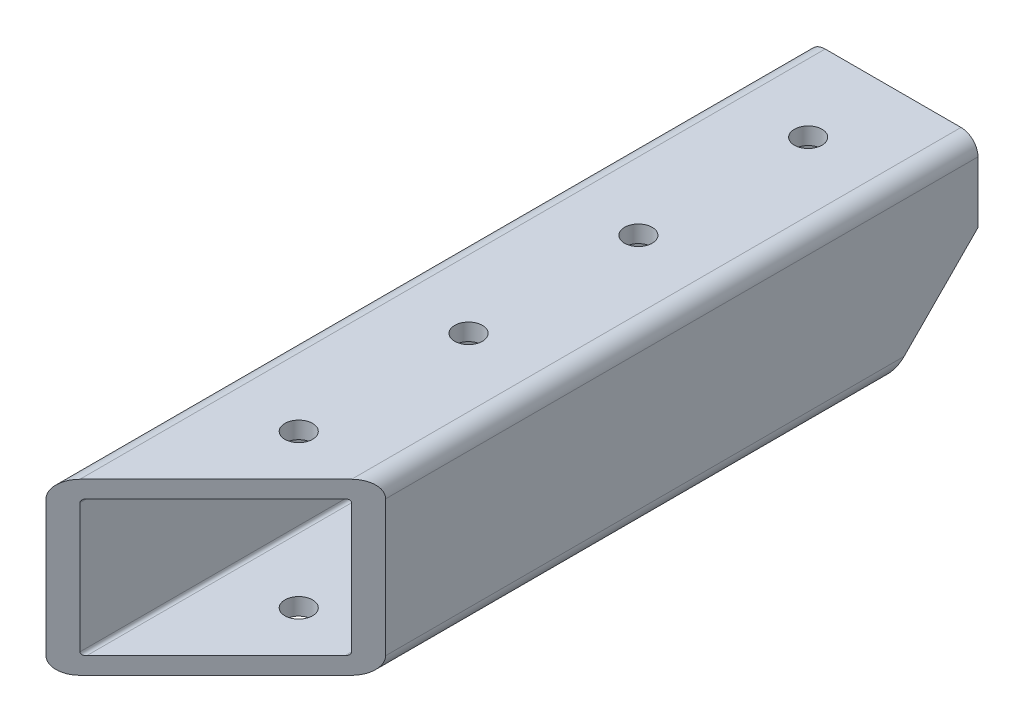
ISO-10303-21;
HEADER;
FILE_DESCRIPTION(('STEP AP214'),'2;1');
FILE_NAME('part.step','',(''),(''),'','','');
FILE_SCHEMA(('AUTOMOTIVE_DESIGN { 1 0 10303 214 1 1 1 1 }'));
ENDSEC;
DATA;
#1=APPLICATION_CONTEXT('core data for automotive mechanical design processes');
#2=APPLICATION_PROTOCOL_DEFINITION('international standard','automotive_design',2000,#1);
#3=PRODUCT_CONTEXT('',#1,'mechanical');
#4=PRODUCT('Part','Part','',(#3));
#5=PRODUCT_RELATED_PRODUCT_CATEGORY('part','',(#4));
#6=PRODUCT_DEFINITION_FORMATION('','',#4);
#7=PRODUCT_DEFINITION_CONTEXT('part definition',#1,'design');
#8=PRODUCT_DEFINITION('design','',#6,#7);
#9=PRODUCT_DEFINITION_SHAPE('','',#8);
#10=(LENGTH_UNIT() NAMED_UNIT(*) SI_UNIT(.MILLI.,.METRE.));
#11=(NAMED_UNIT(*) PLANE_ANGLE_UNIT() SI_UNIT($,.RADIAN.));
#12=(NAMED_UNIT(*) SI_UNIT($,.STERADIAN.) SOLID_ANGLE_UNIT());
#13=UNCERTAINTY_MEASURE_WITH_UNIT(LENGTH_MEASURE(1.E-05),#10,'distance_accuracy_value','');
#14=(GEOMETRIC_REPRESENTATION_CONTEXT(3) GLOBAL_UNCERTAINTY_ASSIGNED_CONTEXT((#13)) GLOBAL_UNIT_ASSIGNED_CONTEXT((#10,
#11,#12)) REPRESENTATION_CONTEXT('',''));
#15=CARTESIAN_POINT('',(0.,0.,0.));
#16=DIRECTION('',(0.,0.,1.));
#17=DIRECTION('',(1.,0.,0.));
#18=AXIS2_PLACEMENT_3D('',#15,#16,#17);
#19=CARTESIAN_POINT('',(0.,-12.7,-711.2));
#20=DIRECTION('',(0.,1.,0.));
#21=DIRECTION('',(0.,0.,1.));
#22=AXIS2_PLACEMENT_3D('',#19,#20,#21);
#23=CYLINDRICAL_SURFACE('',#22,2.07009999999996);
#24=CARTESIAN_POINT('',(0.,10.16,-711.2));
#25=DIRECTION('',(0.,1.,0.));
#26=DIRECTION('',(0.,0.,1.));
#27=AXIS2_PLACEMENT_3D('',#24,#25,#26);
#28=CIRCLE('',#27,2.07009999999996);
#29=CARTESIAN_POINT('',(0.,10.16,-709.1299));
#30=VERTEX_POINT('',#29);
#31=EDGE_CURVE('E269',#30,#30,#28,.T.);
#32=ORIENTED_EDGE('',*,*,#31,.F.);
#33=EDGE_LOOP('',(#32));
#34=FACE_BOUND('',#33,.T.);
#35=CARTESIAN_POINT('',(0.,12.7,-711.2));
#36=DIRECTION('',(0.,1.,0.));
#37=DIRECTION('',(0.,0.,1.));
#38=AXIS2_PLACEMENT_3D('',#35,#36,#37);
#39=CIRCLE('',#38,2.07009999999996);
#40=CARTESIAN_POINT('',(0.,12.7,-709.1299));
#41=VERTEX_POINT('',#40);
#42=EDGE_CURVE('E297',#41,#41,#39,.T.);
#43=ORIENTED_EDGE('',*,*,#42,.T.);
#44=EDGE_LOOP('',(#43));
#45=FACE_BOUND('',#44,.T.);
#46=ADVANCED_FACE('F35',(#34,#45),#23,.F.);
#47=CARTESIAN_POINT('',(0.,-12.7,-736.6));
#48=DIRECTION('',(0.,1.,0.));
#49=DIRECTION('',(0.,0.,1.));
#50=AXIS2_PLACEMENT_3D('',#47,#48,#49);
#51=CYLINDRICAL_SURFACE('',#50,2.07009999999996);
#52=CARTESIAN_POINT('',(0.,10.16,-736.6));
#53=DIRECTION('',(0.,1.,0.));
#54=DIRECTION('',(0.,0.,1.));
#55=AXIS2_PLACEMENT_3D('',#52,#53,#54);
#56=CIRCLE('',#55,2.07009999999996);
#57=CARTESIAN_POINT('',(0.,10.16,-734.5299));
#58=VERTEX_POINT('',#57);
#59=EDGE_CURVE('E266',#58,#58,#56,.T.);
#60=ORIENTED_EDGE('',*,*,#59,.F.);
#61=EDGE_LOOP('',(#60));
#62=FACE_BOUND('',#61,.T.);
#63=CARTESIAN_POINT('',(0.,12.7,-736.6));
#64=DIRECTION('',(0.,1.,0.));
#65=DIRECTION('',(0.,0.,1.));
#66=AXIS2_PLACEMENT_3D('',#63,#64,#65);
#67=CIRCLE('',#66,2.07009999999996);
#68=CARTESIAN_POINT('',(0.,12.7,-734.5299));
#69=VERTEX_POINT('',#68);
#70=EDGE_CURVE('E294',#69,#69,#67,.T.);
#71=ORIENTED_EDGE('',*,*,#70,.T.);
#72=EDGE_LOOP('',(#71));
#73=FACE_BOUND('',#72,.T.);
#74=ADVANCED_FACE('F659',(#62,#73),#51,.F.);
#75=CARTESIAN_POINT('',(-9.65999999999999,9.66,749.3));
#76=DIRECTION('',(0.,0.,1.));
#77=DIRECTION('',(1.,0.,0.));
#78=AXIS2_PLACEMENT_3D('',#75,#76,#77);
#79=CYLINDRICAL_SURFACE('',#78,0.5);
#80=DIRECTION('',(0.,0.,-1.));
#81=VECTOR('',#80,1.);
#82=CARTESIAN_POINT('',(-9.65999999999999,10.16,749.3));
#83=LINE('',#82,#81);
#84=CARTESIAN_POINT('',(-9.66000000000005,10.16,-638.337524484275));
#85=VERTEX_POINT('',#84);
#86=CARTESIAN_POINT('',(-9.65999999999999,10.16,-749.3));
#87=VERTEX_POINT('',#86);
#88=EDGE_CURVE('E260',#85,#87,#83,.T.);
#89=ORIENTED_EDGE('',*,*,#88,.F.);
#90=CARTESIAN_POINT('',(-9.65999999999999,9.66,-638.337524484276));
#91=DIRECTION('',(-0.707106781186566,0.,-0.707106781186529));
#92=DIRECTION('',(-0.707106781186529,0.,0.707106781186566));
#93=AXIS2_PLACEMENT_3D('',#90,#91,#92);
#94=ELLIPSE('',#93,0.707106781186567,0.5);
#95=CARTESIAN_POINT('',(-10.16,9.66,-637.837524484275));
#96=VERTEX_POINT('',#95);
#97=EDGE_CURVE('E353',#85,#96,#94,.F.);
#98=ORIENTED_EDGE('',*,*,#97,.T.);
#99=DIRECTION('',(0.,0.,-1.));
#100=VECTOR('',#99,1.);
#101=CARTESIAN_POINT('',(-10.16,9.66,749.3));
#102=LINE('',#101,#100);
#103=CARTESIAN_POINT('',(-10.16,9.66,-749.3));
#104=VERTEX_POINT('',#103);
#105=EDGE_CURVE('E206',#104,#96,#102,.F.);
#106=ORIENTED_EDGE('',*,*,#105,.F.);
#107=CARTESIAN_POINT('',(-9.65999999999999,9.66,-749.3));
#108=DIRECTION('',(0.,0.,1.));
#109=DIRECTION('',(1.,0.,0.));
#110=AXIS2_PLACEMENT_3D('',#107,#108,#109);
#111=CIRCLE('',#110,0.5);
#112=EDGE_CURVE('E303',#87,#104,#111,.T.);
#113=ORIENTED_EDGE('',*,*,#112,.F.);
#114=EDGE_LOOP('',(#89,#98,#106,#113));
#115=FACE_BOUND('',#114,.T.);
#116=ADVANCED_FACE('F653',(#115),#79,.F.);
#117=CARTESIAN_POINT('',(0.,-12.7,-685.8));
#118=DIRECTION('',(0.,1.,0.));
#119=DIRECTION('',(0.,0.,1.));
#120=AXIS2_PLACEMENT_3D('',#117,#118,#119);
#121=CYLINDRICAL_SURFACE('',#120,2.07009999999996);
#122=CARTESIAN_POINT('',(0.,10.16,-685.8));
#123=DIRECTION('',(0.,1.,0.));
#124=DIRECTION('',(0.,0.,1.));
#125=AXIS2_PLACEMENT_3D('',#122,#123,#124);
#126=CIRCLE('',#125,2.07009999999996);
#127=CARTESIAN_POINT('',(0.,10.16,-683.7299));
#128=VERTEX_POINT('',#127);
#129=EDGE_CURVE('E257',#128,#128,#126,.T.);
#130=ORIENTED_EDGE('',*,*,#129,.F.);
#131=EDGE_LOOP('',(#130));
#132=FACE_BOUND('',#131,.T.);
#133=CARTESIAN_POINT('',(0.,12.7,-685.8));
#134=DIRECTION('',(0.,1.,0.));
#135=DIRECTION('',(0.,0.,1.));
#136=AXIS2_PLACEMENT_3D('',#133,#134,#135);
#137=CIRCLE('',#136,2.07009999999996);
#138=CARTESIAN_POINT('',(0.,12.7,-683.7299));
#139=VERTEX_POINT('',#138);
#140=EDGE_CURVE('E291',#139,#139,#137,.T.);
#141=ORIENTED_EDGE('',*,*,#140,.T.);
#142=EDGE_LOOP('',(#141));
#143=FACE_BOUND('',#142,.T.);
#144=ADVANCED_FACE('F658',(#132,#143),#121,.F.);
#145=CARTESIAN_POINT('',(0.,-12.7,-660.4));
#146=DIRECTION('',(0.,1.,0.));
#147=DIRECTION('',(0.,0.,1.));
#148=AXIS2_PLACEMENT_3D('',#145,#146,#147);
#149=CYLINDRICAL_SURFACE('',#148,2.07009999999996);
#150=CARTESIAN_POINT('',(0.,10.16,-660.4));
#151=DIRECTION('',(0.,1.,0.));
#152=DIRECTION('',(0.,0.,1.));
#153=AXIS2_PLACEMENT_3D('',#150,#151,#152);
#154=CIRCLE('',#153,2.07009999999996);
#155=CARTESIAN_POINT('',(0.,10.16,-658.3299));
#156=VERTEX_POINT('',#155);
#157=EDGE_CURVE('E253',#156,#156,#154,.T.);
#158=ORIENTED_EDGE('',*,*,#157,.F.);
#159=EDGE_LOOP('',(#158));
#160=FACE_BOUND('',#159,.T.);
#161=CARTESIAN_POINT('',(0.,12.7,-660.4));
#162=DIRECTION('',(0.,1.,0.));
#163=DIRECTION('',(0.,0.,1.));
#164=AXIS2_PLACEMENT_3D('',#161,#162,#163);
#165=CIRCLE('',#164,2.07009999999996);
#166=CARTESIAN_POINT('',(0.,12.7,-658.3299));
#167=VERTEX_POINT('',#166);
#168=EDGE_CURVE('E288',#167,#167,#165,.T.);
#169=ORIENTED_EDGE('',*,*,#168,.T.);
#170=EDGE_LOOP('',(#169));
#171=FACE_BOUND('',#170,.T.);
#172=ADVANCED_FACE('F644',(#160,#171),#149,.F.);
#173=CARTESIAN_POINT('',(9.66,9.65999999999999,749.3));
#174=DIRECTION('',(0.,0.,1.));
#175=DIRECTION('',(1.,0.,0.));
#176=AXIS2_PLACEMENT_3D('',#173,#174,#175);
#177=CYLINDRICAL_SURFACE('',#176,0.5);
#178=DIRECTION('',(0.,0.,1.));
#179=VECTOR('',#178,1.);
#180=CARTESIAN_POINT('',(10.16,9.65999999999999,749.3));
#181=LINE('',#180,#179);
#182=CARTESIAN_POINT('',(10.16,9.65999999999999,-658.157524484277));
#183=VERTEX_POINT('',#182);
#184=CARTESIAN_POINT('',(10.16,9.65999999999999,-749.3));
#185=VERTEX_POINT('',#184);
#186=EDGE_CURVE('E256',#183,#185,#181,.F.);
#187=ORIENTED_EDGE('',*,*,#186,.F.);
#188=CARTESIAN_POINT('',(9.66,9.65999999999999,-657.657524484276));
#189=DIRECTION('',(-0.707106781186566,0.,-0.707106781186529));
#190=DIRECTION('',(-0.707106781186529,0.,0.707106781186566));
#191=AXIS2_PLACEMENT_3D('',#188,#189,#190);
#192=ELLIPSE('',#191,0.707106781186567,0.5);
#193=CARTESIAN_POINT('',(9.66,10.16,-657.657524484276));
#194=VERTEX_POINT('',#193);
#195=EDGE_CURVE('E357',#183,#194,#192,.F.);
#196=ORIENTED_EDGE('',*,*,#195,.T.);
#197=DIRECTION('',(0.,0.,-1.));
#198=VECTOR('',#197,1.);
#199=CARTESIAN_POINT('',(9.66,10.16,749.3));
#200=LINE('',#199,#198);
#201=CARTESIAN_POINT('',(9.66,10.16,-749.3));
#202=VERTEX_POINT('',#201);
#203=EDGE_CURVE('E262',#202,#194,#200,.F.);
#204=ORIENTED_EDGE('',*,*,#203,.F.);
#205=CARTESIAN_POINT('',(9.66,9.65999999999999,-749.3));
#206=DIRECTION('',(0.,0.,1.));
#207=DIRECTION('',(1.,0.,0.));
#208=AXIS2_PLACEMENT_3D('',#205,#206,#207);
#209=CIRCLE('',#208,0.5);
#210=EDGE_CURVE('E301',#185,#202,#209,.T.);
#211=ORIENTED_EDGE('',*,*,#210,.F.);
#212=EDGE_LOOP('',(#187,#196,#204,#211));
#213=FACE_BOUND('',#212,.T.);
#214=ADVANCED_FACE('F639',(#213),#177,.F.);
#215=CARTESIAN_POINT('',(0.,-12.7,-711.2));
#216=DIRECTION('',(0.,1.,0.));
#217=DIRECTION('',(0.,0.,1.));
#218=AXIS2_PLACEMENT_3D('',#215,#216,#217);
#219=CYLINDRICAL_SURFACE('',#218,2.07009999999996);
#220=CARTESIAN_POINT('',(0.,-10.16,-711.2));
#221=DIRECTION('',(0.,1.,0.));
#222=DIRECTION('',(0.,0.,1.));
#223=AXIS2_PLACEMENT_3D('',#220,#221,#222);
#224=CIRCLE('',#223,2.07009999999996);
#225=CARTESIAN_POINT('',(0.,-10.16,-709.1299));
#226=VERTEX_POINT('',#225);
#227=EDGE_CURVE('E249',#226,#226,#224,.F.);
#228=ORIENTED_EDGE('',*,*,#227,.F.);
#229=EDGE_LOOP('',(#228));
#230=FACE_BOUND('',#229,.T.);
#231=CARTESIAN_POINT('',(0.,-12.7,-711.2));
#232=DIRECTION('',(0.,1.,0.));
#233=DIRECTION('',(0.,0.,1.));
#234=AXIS2_PLACEMENT_3D('',#231,#232,#233);
#235=CIRCLE('',#234,2.07009999999996);
#236=CARTESIAN_POINT('',(0.,-12.7,-709.1299));
#237=VERTEX_POINT('',#236);
#238=EDGE_CURVE('E192',#237,#237,#235,.F.);
#239=ORIENTED_EDGE('',*,*,#238,.T.);
#240=EDGE_LOOP('',(#239));
#241=FACE_BOUND('',#240,.T.);
#242=ADVANCED_FACE('F597',(#230,#241),#219,.F.);
#243=CARTESIAN_POINT('',(0.,-12.7,-736.6));
#244=DIRECTION('',(0.,1.,0.));
#245=DIRECTION('',(0.,0.,1.));
#246=AXIS2_PLACEMENT_3D('',#243,#244,#245);
#247=CYLINDRICAL_SURFACE('',#246,2.07009999999996);
#248=CARTESIAN_POINT('',(0.,-10.16,-736.6));
#249=DIRECTION('',(0.,1.,0.));
#250=DIRECTION('',(0.,0.,1.));
#251=AXIS2_PLACEMENT_3D('',#248,#249,#250);
#252=CIRCLE('',#251,2.07009999999996);
#253=CARTESIAN_POINT('',(1.24355782247685,-10.16,-738.254955574073));
#254=VERTEX_POINT('',#253);
#255=CARTESIAN_POINT('',(-1.24355782247685,-10.16,-738.254955574073));
#256=VERTEX_POINT('',#255);
#257=EDGE_CURVE('E245',#254,#256,#252,.F.);
#258=ORIENTED_EDGE('',*,*,#257,.F.);
#259=CARTESIAN_POINT('',(0.,-11.8335169593732,-736.6));
#260=DIRECTION('',(0.,0.70315263341539,0.711038939947034));
#261=DIRECTION('',(0.,0.711038939947034,-0.703152633415391));
#262=AXIS2_PLACEMENT_3D('',#259,#260,#261);
#263=ELLIPSE('',#262,2.94402651945562,2.07009999999996);
#264=CARTESIAN_POINT('',(1.88443180957197,-12.7,-735.743127334388));
#265=VERTEX_POINT('',#264);
#266=EDGE_CURVE('E396',#254,#265,#263,.F.);
#267=ORIENTED_EDGE('',*,*,#266,.T.);
#268=CARTESIAN_POINT('',(0.,-12.7,-736.6));
#269=DIRECTION('',(0.,1.,0.));
#270=DIRECTION('',(0.,0.,1.));
#271=AXIS2_PLACEMENT_3D('',#268,#269,#270);
#272=CIRCLE('',#271,2.07009999999996);
#273=CARTESIAN_POINT('',(-1.88443180957197,-12.7,-735.743127334388));
#274=VERTEX_POINT('',#273);
#275=EDGE_CURVE('E199',#265,#274,#272,.F.);
#276=ORIENTED_EDGE('',*,*,#275,.T.);
#277=EDGE_CURVE('E399',#274,#256,#263,.F.);
#278=ORIENTED_EDGE('',*,*,#277,.T.);
#279=EDGE_LOOP('',(#258,#267,#276,#278));
#280=FACE_BOUND('',#279,.T.);
#281=ADVANCED_FACE('F443',(#280),#247,.F.);
#282=CARTESIAN_POINT('',(-9.65999999999999,-9.66,749.3));
#283=DIRECTION('',(0.,0.,1.));
#284=DIRECTION('',(1.,0.,0.));
#285=AXIS2_PLACEMENT_3D('',#282,#283,#284);
#286=CYLINDRICAL_SURFACE('',#285,0.5);
#287=DIRECTION('',(0.,0.,1.));
#288=VECTOR('',#287,1.);
#289=CARTESIAN_POINT('',(-9.65999999999999,-10.16,749.3));
#290=LINE('',#289,#288);
#291=CARTESIAN_POINT('',(-9.65999999999999,-10.16,-738.254955574073));
#292=VERTEX_POINT('',#291);
#293=CARTESIAN_POINT('',(-9.66000000000011,-10.16,-638.337524484275));
#294=VERTEX_POINT('',#293);
#295=EDGE_CURVE('E242',#292,#294,#290,.T.);
#296=ORIENTED_EDGE('',*,*,#295,.F.);
#297=CARTESIAN_POINT('',(-9.65999999999999,-9.66,-738.749409951964));
#298=DIRECTION('',(0.,0.70315263341539,0.711038939947034));
#299=DIRECTION('',(0.,-0.711038939947034,0.703152633415391));
#300=AXIS2_PLACEMENT_3D('',#297,#298,#299);
#301=ELLIPSE('',#300,0.703196367891252,0.5);
#302=CARTESIAN_POINT('',(-10.16,-9.66,-738.749409951964));
#303=VERTEX_POINT('',#302);
#304=EDGE_CURVE('E401',#292,#303,#301,.F.);
#305=ORIENTED_EDGE('',*,*,#304,.T.);
#306=DIRECTION('',(0.,0.,-1.));
#307=VECTOR('',#306,1.);
#308=CARTESIAN_POINT('',(-10.16,-9.66,749.3));
#309=LINE('',#308,#307);
#310=CARTESIAN_POINT('',(-10.16,-9.66,-637.837524484275));
#311=VERTEX_POINT('',#310);
#312=EDGE_CURVE('E273',#311,#303,#309,.T.);
#313=ORIENTED_EDGE('',*,*,#312,.F.);
#314=CARTESIAN_POINT('',(-9.65999999999999,-9.66,-638.337524484276));
#315=DIRECTION('',(-0.707106781186566,0.,-0.707106781186529));
#316=DIRECTION('',(-0.707106781186529,0.,0.707106781186566));
#317=AXIS2_PLACEMENT_3D('',#314,#315,#316);
#318=ELLIPSE('',#317,0.707106781186567,0.5);
#319=EDGE_CURVE('E356',#311,#294,#318,.F.);
#320=ORIENTED_EDGE('',*,*,#319,.T.);
#321=EDGE_LOOP('',(#296,#305,#313,#320));
#322=FACE_BOUND('',#321,.T.);
#323=ADVANCED_FACE('F429',(#322),#286,.F.);
#324=CARTESIAN_POINT('',(9.66,-9.66,749.3));
#325=DIRECTION('',(0.,0.,1.));
#326=DIRECTION('',(1.,0.,0.));
#327=AXIS2_PLACEMENT_3D('',#324,#325,#326);
#328=CYLINDRICAL_SURFACE('',#327,0.5);
#329=DIRECTION('',(0.,0.,1.));
#330=VECTOR('',#329,1.);
#331=CARTESIAN_POINT('',(10.16,-9.66,749.3));
#332=LINE('',#331,#330);
#333=CARTESIAN_POINT('',(10.16,-9.66,-738.749409951964));
#334=VERTEX_POINT('',#333);
#335=CARTESIAN_POINT('',(10.16,-9.66,-658.157524484277));
#336=VERTEX_POINT('',#335);
#337=EDGE_CURVE('E252',#334,#336,#332,.T.);
#338=ORIENTED_EDGE('',*,*,#337,.F.);
#339=CARTESIAN_POINT('',(9.66,-9.66,-738.749409951964));
#340=DIRECTION('',(0.,0.70315263341539,0.711038939947034));
#341=DIRECTION('',(0.,-0.711038939947034,0.703152633415391));
#342=AXIS2_PLACEMENT_3D('',#339,#340,#341);
#343=ELLIPSE('',#342,0.703196367891252,0.5);
#344=CARTESIAN_POINT('',(9.66,-10.16,-738.254955574073));
#345=VERTEX_POINT('',#344);
#346=EDGE_CURVE('E392',#334,#345,#343,.F.);
#347=ORIENTED_EDGE('',*,*,#346,.T.);
#348=DIRECTION('',(0.,0.,1.));
#349=VECTOR('',#348,1.);
#350=CARTESIAN_POINT('',(9.66,-10.16,749.3));
#351=LINE('',#350,#349);
#352=CARTESIAN_POINT('',(9.66,-10.16,-657.657524484276));
#353=VERTEX_POINT('',#352);
#354=EDGE_CURVE('E238',#353,#345,#351,.F.);
#355=ORIENTED_EDGE('',*,*,#354,.F.);
#356=CARTESIAN_POINT('',(9.66,-9.66,-657.657524484276));
#357=DIRECTION('',(-0.707106781186566,0.,-0.707106781186529));
#358=DIRECTION('',(-0.707106781186529,0.,0.707106781186566));
#359=AXIS2_PLACEMENT_3D('',#356,#357,#358);
#360=ELLIPSE('',#359,0.707106781186567,0.5);
#361=EDGE_CURVE('E425',#353,#336,#360,.F.);
#362=ORIENTED_EDGE('',*,*,#361,.T.);
#363=EDGE_LOOP('',(#338,#347,#355,#362));
#364=FACE_BOUND('',#363,.T.);
#365=ADVANCED_FACE('F438',(#364),#328,.F.);
#366=CARTESIAN_POINT('',(0.,-12.7,-685.8));
#367=DIRECTION('',(0.,1.,0.));
#368=DIRECTION('',(0.,0.,1.));
#369=AXIS2_PLACEMENT_3D('',#366,#367,#368);
#370=CYLINDRICAL_SURFACE('',#369,2.07009999999996);
#371=CARTESIAN_POINT('',(0.,-10.16,-685.8));
#372=DIRECTION('',(0.,1.,0.));
#373=DIRECTION('',(0.,0.,1.));
#374=AXIS2_PLACEMENT_3D('',#371,#372,#373);
#375=CIRCLE('',#374,2.07009999999996);
#376=CARTESIAN_POINT('',(0.,-10.16,-683.7299));
#377=VERTEX_POINT('',#376);
#378=EDGE_CURVE('E235',#377,#377,#375,.F.);
#379=ORIENTED_EDGE('',*,*,#378,.F.);
#380=EDGE_LOOP('',(#379));
#381=FACE_BOUND('',#380,.T.);
#382=CARTESIAN_POINT('',(0.,-12.7,-685.8));
#383=DIRECTION('',(0.,1.,0.));
#384=DIRECTION('',(0.,0.,1.));
#385=AXIS2_PLACEMENT_3D('',#382,#383,#384);
#386=CIRCLE('',#385,2.07009999999996);
#387=CARTESIAN_POINT('',(0.,-12.7,-683.7299));
#388=VERTEX_POINT('',#387);
#389=EDGE_CURVE('E278',#388,#388,#386,.F.);
#390=ORIENTED_EDGE('',*,*,#389,.T.);
#391=EDGE_LOOP('',(#390));
#392=FACE_BOUND('',#391,.T.);
#393=ADVANCED_FACE('F580',(#381,#392),#370,.F.);
#394=CARTESIAN_POINT('',(0.,-12.7,-660.4));
#395=DIRECTION('',(0.,1.,0.));
#396=DIRECTION('',(0.,0.,1.));
#397=AXIS2_PLACEMENT_3D('',#394,#395,#396);
#398=CYLINDRICAL_SURFACE('',#397,2.07009999999996);
#399=CARTESIAN_POINT('',(0.,-10.16,-660.4));
#400=DIRECTION('',(0.,1.,0.));
#401=DIRECTION('',(0.,0.,1.));
#402=AXIS2_PLACEMENT_3D('',#399,#400,#401);
#403=CIRCLE('',#402,2.07009999999996);
#404=CARTESIAN_POINT('',(0.,-10.16,-658.3299));
#405=VERTEX_POINT('',#404);
#406=EDGE_CURVE('E231',#405,#405,#403,.F.);
#407=ORIENTED_EDGE('',*,*,#406,.F.);
#408=EDGE_LOOP('',(#407));
#409=FACE_BOUND('',#408,.T.);
#410=CARTESIAN_POINT('',(0.,-12.7,-660.4));
#411=DIRECTION('',(0.,1.,0.));
#412=DIRECTION('',(0.,0.,1.));
#413=AXIS2_PLACEMENT_3D('',#410,#411,#412);
#414=CIRCLE('',#413,2.07009999999996);
#415=CARTESIAN_POINT('',(0.,-12.7,-658.3299));
#416=VERTEX_POINT('',#415);
#417=EDGE_CURVE('E274',#416,#416,#414,.F.);
#418=ORIENTED_EDGE('',*,*,#417,.T.);
#419=EDGE_LOOP('',(#418));
#420=FACE_BOUND('',#419,.T.);
#421=ADVANCED_FACE('F632',(#409,#420),#398,.F.);
#422=CARTESIAN_POINT('',(-10.16,12.7,749.3));
#423=DIRECTION('',(0.,-1.,0.));
#424=DIRECTION('',(0.,0.,-1.));
#425=AXIS2_PLACEMENT_3D('',#422,#423,#424);
#426=PLANE('',#425);
#427=ORIENTED_EDGE('',*,*,#168,.F.);
#428=EDGE_LOOP('',(#427));
#429=FACE_BOUND('',#428,.T.);
#430=ORIENTED_EDGE('',*,*,#140,.F.);
#431=EDGE_LOOP('',(#430));
#432=FACE_BOUND('',#431,.T.);
#433=DIRECTION('',(0.,0.,-1.));
#434=VECTOR('',#433,1.);
#435=CARTESIAN_POINT('',(-10.16,12.7,749.3));
#436=LINE('',#435,#434);
#437=CARTESIAN_POINT('',(-10.16,12.7,-637.837524484275));
#438=VERTEX_POINT('',#437);
#439=CARTESIAN_POINT('',(-10.16,12.7,-749.3));
#440=VERTEX_POINT('',#439);
#441=EDGE_CURVE('E203',#438,#440,#436,.T.);
#442=ORIENTED_EDGE('',*,*,#441,.F.);
#443=DIRECTION('',(0.707106781186529,0.,-0.707106781186566));
#444=VECTOR('',#443,1.);
#445=CARTESIAN_POINT('',(-703.728762242138,12.7,55.7312377578993));
#446=LINE('',#445,#444);
#447=CARTESIAN_POINT('',(10.16,12.7,-658.157524484277));
#448=VERTEX_POINT('',#447);
#449=EDGE_CURVE('E419',#438,#448,#446,.T.);
#450=ORIENTED_EDGE('',*,*,#449,.T.);
#451=DIRECTION('',(0.,0.,-1.));
#452=VECTOR('',#451,1.);
#453=CARTESIAN_POINT('',(10.16,12.7,749.3));
#454=LINE('',#453,#452);
#455=CARTESIAN_POINT('',(10.16,12.7,-749.3));
#456=VERTEX_POINT('',#455);
#457=EDGE_CURVE('E223',#456,#448,#454,.F.);
#458=ORIENTED_EDGE('',*,*,#457,.F.);
#459=DIRECTION('',(1.,0.,0.));
#460=VECTOR('',#459,1.);
#461=CARTESIAN_POINT('',(-10.16,12.7,-749.3));
#462=LINE('',#461,#460);
#463=EDGE_CURVE('E217',#456,#440,#462,.F.);
#464=ORIENTED_EDGE('',*,*,#463,.T.);
#465=EDGE_LOOP('',(#442,#450,#458,#464));
#466=FACE_BOUND('',#465,.T.);
#467=ORIENTED_EDGE('',*,*,#70,.F.);
#468=EDGE_LOOP('',(#467));
#469=FACE_BOUND('',#468,.T.);
#470=ORIENTED_EDGE('',*,*,#42,.F.);
#471=EDGE_LOOP('',(#470));
#472=FACE_BOUND('',#471,.T.);
#473=ADVANCED_FACE('F458',(#429,#432,#466,#469,#472),#426,.F.);
#474=CARTESIAN_POINT('',(-10.16,10.16,749.3));
#475=DIRECTION('',(0.,0.,-1.));
#476=DIRECTION('',(-1.,0.,0.));
#477=AXIS2_PLACEMENT_3D('',#474,#475,#476);
#478=CYLINDRICAL_SURFACE('',#477,2.54);
#479=CARTESIAN_POINT('',(-10.16,10.16,-637.837524484275));
#480=DIRECTION('',(-0.707106781186566,0.,-0.707106781186529));
#481=DIRECTION('',(0.707106781186529,0.,-0.707106781186566));
#482=AXIS2_PLACEMENT_3D('',#479,#480,#481);
#483=ELLIPSE('',#482,3.59210244842776,2.54);
#484=CARTESIAN_POINT('',(-12.7,10.16,-635.297524484275));
#485=VERTEX_POINT('',#484);
#486=EDGE_CURVE('E417',#438,#485,#483,.F.);
#487=ORIENTED_EDGE('',*,*,#486,.F.);
#488=ORIENTED_EDGE('',*,*,#441,.T.);
#489=CARTESIAN_POINT('',(-10.16,10.16,-749.3));
#490=DIRECTION('',(0.,0.,-1.));
#491=DIRECTION('',(-1.,0.,0.));
#492=AXIS2_PLACEMENT_3D('',#489,#490,#491);
#493=CIRCLE('',#492,2.54);
#494=CARTESIAN_POINT('',(-12.7,10.16,-749.3));
#495=VERTEX_POINT('',#494);
#496=EDGE_CURVE('E214',#440,#495,#493,.F.);
#497=ORIENTED_EDGE('',*,*,#496,.T.);
#498=DIRECTION('',(0.,0.,-1.));
#499=VECTOR('',#498,1.);
#500=CARTESIAN_POINT('',(-12.7,10.16,749.3));
#501=LINE('',#500,#499);
#502=EDGE_CURVE('E193',#495,#485,#501,.F.);
#503=ORIENTED_EDGE('',*,*,#502,.T.);
#504=EDGE_LOOP('',(#487,#488,#497,#503));
#505=FACE_BOUND('',#504,.T.);
#506=ADVANCED_FACE('F453',(#505),#478,.T.);
#507=CARTESIAN_POINT('',(-12.7,-10.16,749.3));
#508=DIRECTION('',(1.,0.,0.));
#509=DIRECTION('',(0.,0.,-1.));
#510=AXIS2_PLACEMENT_3D('',#507,#508,#509);
#511=PLANE('',#510);
#512=DIRECTION('',(0.,1.,0.));
#513=VECTOR('',#512,1.);
#514=CARTESIAN_POINT('',(-12.7,-10.16,-749.3));
#515=LINE('',#514,#513);
#516=CARTESIAN_POINT('',(-12.7,1.00892166375388,-749.3));
#517=VERTEX_POINT('',#516);
#518=EDGE_CURVE('E185',#495,#517,#515,.F.);
#519=ORIENTED_EDGE('',*,*,#518,.T.);
#520=DIRECTION('',(0.,0.711038939947034,-0.70315263341539));
#521=VECTOR('',#520,1.);
#522=CARTESIAN_POINT('',(-12.7,1.00892166375388,-749.3));
#523=LINE('',#522,#521);
#524=CARTESIAN_POINT('',(-12.7,-10.1600000000001,-738.254955574073));
#525=VERTEX_POINT('',#524);
#526=EDGE_CURVE('E49',#525,#517,#523,.T.);
#527=ORIENTED_EDGE('',*,*,#526,.F.);
#528=DIRECTION('',(0.,0.,-1.));
#529=VECTOR('',#528,1.);
#530=CARTESIAN_POINT('',(-12.7,-10.16,749.3));
#531=LINE('',#530,#529);
#532=CARTESIAN_POINT('',(-12.7,-10.16,-635.297524484275));
#533=VERTEX_POINT('',#532);
#534=EDGE_CURVE('E183',#533,#525,#531,.T.);
#535=ORIENTED_EDGE('',*,*,#534,.F.);
#536=DIRECTION('',(0.,1.,0.));
#537=VECTOR('',#536,1.);
#538=CARTESIAN_POINT('',(-12.7,-10.1600000000002,-635.297524484275));
#539=LINE('',#538,#537);
#540=EDGE_CURVE('E414',#533,#485,#539,.T.);
#541=ORIENTED_EDGE('',*,*,#540,.T.);
#542=ORIENTED_EDGE('',*,*,#502,.F.);
#543=EDGE_LOOP('',(#519,#527,#535,#541,#542));
#544=FACE_BOUND('',#543,.T.);
#545=ADVANCED_FACE('F181',(#544),#511,.F.);
#546=CARTESIAN_POINT('',(-10.16,-10.16,749.3));
#547=DIRECTION('',(0.,0.,-1.));
#548=DIRECTION('',(-1.,0.,0.));
#549=AXIS2_PLACEMENT_3D('',#546,#547,#548);
#550=CYLINDRICAL_SURFACE('',#549,2.54);
#551=CARTESIAN_POINT('',(-10.16,-10.16,-738.254955574073));
#552=DIRECTION('',(0.,0.70315263341539,0.711038939947034));
#553=DIRECTION('',(0.,0.711038939947034,-0.703152633415391));
#554=AXIS2_PLACEMENT_3D('',#551,#552,#553);
#555=ELLIPSE('',#554,3.57223754888756,2.54);
#556=CARTESIAN_POINT('',(-10.16,-12.7,-735.743127334388));
#557=VERTEX_POINT('',#556);
#558=EDGE_CURVE('E168',#557,#525,#555,.F.);
#559=ORIENTED_EDGE('',*,*,#558,.F.);
#560=DIRECTION('',(0.,0.,-1.));
#561=VECTOR('',#560,1.);
#562=CARTESIAN_POINT('',(-10.16,-12.7,749.3));
#563=LINE('',#562,#561);
#564=CARTESIAN_POINT('',(-10.1599999999999,-12.7,-637.837524484275));
#565=VERTEX_POINT('',#564);
#566=EDGE_CURVE('E282',#557,#565,#563,.F.);
#567=ORIENTED_EDGE('',*,*,#566,.T.);
#568=CARTESIAN_POINT('',(-10.16,-10.16,-637.837524484275));
#569=DIRECTION('',(-0.707106781186566,0.,-0.707106781186529));
#570=DIRECTION('',(0.707106781186529,0.,-0.707106781186566));
#571=AXIS2_PLACEMENT_3D('',#568,#569,#570);
#572=ELLIPSE('',#571,3.59210244842776,2.54);
#573=EDGE_CURVE('E190',#533,#565,#572,.F.);
#574=ORIENTED_EDGE('',*,*,#573,.F.);
#575=ORIENTED_EDGE('',*,*,#534,.T.);
#576=EDGE_LOOP('',(#559,#567,#574,#575));
#577=FACE_BOUND('',#576,.T.);
#578=ADVANCED_FACE('F188',(#577),#550,.T.);
#579=CARTESIAN_POINT('',(-10.16,-12.7,749.3));
#580=DIRECTION('',(0.,1.,0.));
#581=DIRECTION('',(0.,0.,1.));
#582=AXIS2_PLACEMENT_3D('',#579,#580,#581);
#583=PLANE('',#582);
#584=ORIENTED_EDGE('',*,*,#417,.F.);
#585=EDGE_LOOP('',(#584));
#586=FACE_BOUND('',#585,.T.);
#587=ORIENTED_EDGE('',*,*,#389,.F.);
#588=EDGE_LOOP('',(#587));
#589=FACE_BOUND('',#588,.T.);
#590=ORIENTED_EDGE('',*,*,#566,.F.);
#591=DIRECTION('',(-1.,0.,0.));
#592=VECTOR('',#591,1.);
#593=CARTESIAN_POINT('',(12.7,-12.7,-735.743127334388));
#594=LINE('',#593,#592);
#595=EDGE_CURVE('E171',#274,#557,#594,.T.);
#596=ORIENTED_EDGE('',*,*,#595,.F.);
#597=ORIENTED_EDGE('',*,*,#275,.F.);
#598=CARTESIAN_POINT('',(10.16,-12.7,-735.743127334388));
#599=VERTEX_POINT('',#598);
#600=EDGE_CURVE('E388',#599,#265,#594,.T.);
#601=ORIENTED_EDGE('',*,*,#600,.F.);
#602=DIRECTION('',(0.,0.,-1.));
#603=VECTOR('',#602,1.);
#604=CARTESIAN_POINT('',(10.16,-12.7,749.3));
#605=LINE('',#604,#603);
#606=CARTESIAN_POINT('',(10.16,-12.7,-658.157524484277));
#607=VERTEX_POINT('',#606);
#608=EDGE_CURVE('E227',#607,#599,#605,.T.);
#609=ORIENTED_EDGE('',*,*,#608,.F.);
#610=DIRECTION('',(-0.707106781186529,0.,0.707106781186566));
#611=VECTOR('',#610,1.);
#612=CARTESIAN_POINT('',(-703.728762242138,-12.7,55.7312377578993));
#613=LINE('',#612,#611);
#614=EDGE_CURVE('E410',#607,#565,#613,.T.);
#615=ORIENTED_EDGE('',*,*,#614,.T.);
#616=EDGE_LOOP('',(#590,#596,#597,#601,#609,#615));
#617=FACE_BOUND('',#616,.T.);
#618=ORIENTED_EDGE('',*,*,#238,.F.);
#619=EDGE_LOOP('',(#618));
#620=FACE_BOUND('',#619,.T.);
#621=ADVANCED_FACE('F446',(#586,#589,#617,#620),#583,.F.);
#622=CARTESIAN_POINT('',(-10.16,-10.16,749.3));
#623=DIRECTION('',(1.,0.,0.));
#624=DIRECTION('',(0.,0.,-1.));
#625=AXIS2_PLACEMENT_3D('',#622,#623,#624);
#626=PLANE('',#625);
#627=DIRECTION('',(0.,-0.711038939947034,0.70315263341539));
#628=VECTOR('',#627,1.);
#629=CARTESIAN_POINT('',(-10.16,-753.891219416496,-2.77264074486738));
#630=LINE('',#629,#628);
#631=CARTESIAN_POINT('',(-10.16,1.00892166375388,-749.3));
#632=VERTEX_POINT('',#631);
#633=EDGE_CURVE('E176',#632,#303,#630,.T.);
#634=ORIENTED_EDGE('',*,*,#633,.F.);
#635=DIRECTION('',(0.,1.,0.));
#636=VECTOR('',#635,1.);
#637=CARTESIAN_POINT('',(-10.16,-10.16,-749.3));
#638=LINE('',#637,#636);
#639=EDGE_CURVE('E213',#632,#104,#638,.T.);
#640=ORIENTED_EDGE('',*,*,#639,.T.);
#641=ORIENTED_EDGE('',*,*,#105,.T.);
#642=DIRECTION('',(0.,1.,0.));
#643=VECTOR('',#642,1.);
#644=CARTESIAN_POINT('',(-10.16,-10.1600000000002,-637.837524484275));
#645=LINE('',#644,#643);
#646=EDGE_CURVE('E343',#311,#96,#645,.T.);
#647=ORIENTED_EDGE('',*,*,#646,.F.);
#648=ORIENTED_EDGE('',*,*,#312,.T.);
#649=EDGE_LOOP('',(#634,#640,#641,#647,#648));
#650=FACE_BOUND('',#649,.T.);
#651=ADVANCED_FACE('F342',(#650),#626,.T.);
#652=CARTESIAN_POINT('',(-10.16,10.16,749.3));
#653=DIRECTION('',(0.,-1.,0.));
#654=DIRECTION('',(0.,0.,-1.));
#655=AXIS2_PLACEMENT_3D('',#652,#653,#654);
#656=PLANE('',#655);
#657=DIRECTION('',(0.707106781186529,0.,-0.707106781186566));
#658=VECTOR('',#657,1.);
#659=CARTESIAN_POINT('',(-703.728762242138,10.16,55.7312377578993));
#660=LINE('',#659,#658);
#661=EDGE_CURVE('E305',#85,#194,#660,.T.);
#662=ORIENTED_EDGE('',*,*,#661,.F.);
#663=ORIENTED_EDGE('',*,*,#88,.T.);
#664=DIRECTION('',(1.,0.,0.));
#665=VECTOR('',#664,1.);
#666=CARTESIAN_POINT('',(-10.16,10.16,-749.3));
#667=LINE('',#666,#665);
#668=EDGE_CURVE('E209',#87,#202,#667,.T.);
#669=ORIENTED_EDGE('',*,*,#668,.T.);
#670=ORIENTED_EDGE('',*,*,#203,.T.);
#671=EDGE_LOOP('',(#662,#663,#669,#670));
#672=FACE_BOUND('',#671,.T.);
#673=ORIENTED_EDGE('',*,*,#157,.T.);
#674=EDGE_LOOP('',(#673));
#675=FACE_BOUND('',#674,.T.);
#676=ORIENTED_EDGE('',*,*,#129,.T.);
#677=EDGE_LOOP('',(#676));
#678=FACE_BOUND('',#677,.T.);
#679=ORIENTED_EDGE('',*,*,#59,.T.);
#680=EDGE_LOOP('',(#679));
#681=FACE_BOUND('',#680,.T.);
#682=ORIENTED_EDGE('',*,*,#31,.T.);
#683=EDGE_LOOP('',(#682));
#684=FACE_BOUND('',#683,.T.);
#685=ADVANCED_FACE('F531',(#672,#675,#678,#681,#684),#656,.T.);
#686=CARTESIAN_POINT('',(10.16,-10.16,749.3));
#687=DIRECTION('',(-1.,0.,0.));
#688=DIRECTION('',(0.,0.,1.));
#689=AXIS2_PLACEMENT_3D('',#686,#687,#688);
#690=PLANE('',#689);
#691=DIRECTION('',(0.,0.711038939947034,-0.70315263341539));
#692=VECTOR('',#691,1.);
#693=CARTESIAN_POINT('',(10.16,-753.891219416496,-2.77264074486738));
#694=LINE('',#693,#692);
#695=CARTESIAN_POINT('',(10.16,1.00892166375388,-749.3));
#696=VERTEX_POINT('',#695);
#697=EDGE_CURVE('E376',#334,#696,#694,.T.);
#698=ORIENTED_EDGE('',*,*,#697,.F.);
#699=ORIENTED_EDGE('',*,*,#337,.T.);
#700=DIRECTION('',(0.,-1.,0.));
#701=VECTOR('',#700,1.);
#702=CARTESIAN_POINT('',(10.16,-10.1600000000002,-658.157524484277));
#703=LINE('',#702,#701);
#704=EDGE_CURVE('E358',#183,#336,#703,.T.);
#705=ORIENTED_EDGE('',*,*,#704,.F.);
#706=ORIENTED_EDGE('',*,*,#186,.T.);
#707=DIRECTION('',(0.,1.,0.));
#708=VECTOR('',#707,1.);
#709=CARTESIAN_POINT('',(10.16,-10.16,-749.3));
#710=LINE('',#709,#708);
#711=EDGE_CURVE('E212',#185,#696,#710,.F.);
#712=ORIENTED_EDGE('',*,*,#711,.T.);
#713=EDGE_LOOP('',(#698,#699,#705,#706,#712));
#714=FACE_BOUND('',#713,.T.);
#715=ADVANCED_FACE('F375',(#714),#690,.T.);
#716=CARTESIAN_POINT('',(-10.16,-10.16,749.3));
#717=DIRECTION('',(0.,1.,0.));
#718=DIRECTION('',(0.,0.,1.));
#719=AXIS2_PLACEMENT_3D('',#716,#717,#718);
#720=PLANE('',#719);
#721=DIRECTION('',(1.,0.,0.));
#722=VECTOR('',#721,1.);
#723=CARTESIAN_POINT('',(-10.16,-10.16,-738.254955574073));
#724=LINE('',#723,#722);
#725=EDGE_CURVE('E393',#292,#256,#724,.T.);
#726=ORIENTED_EDGE('',*,*,#725,.F.);
#727=ORIENTED_EDGE('',*,*,#295,.T.);
#728=DIRECTION('',(-0.707106781186529,0.,0.707106781186566));
#729=VECTOR('',#728,1.);
#730=CARTESIAN_POINT('',(-703.728762242138,-10.16,55.7312377578993));
#731=LINE('',#730,#729);
#732=EDGE_CURVE('E422',#353,#294,#731,.T.);
#733=ORIENTED_EDGE('',*,*,#732,.F.);
#734=ORIENTED_EDGE('',*,*,#354,.T.);
#735=EDGE_CURVE('E386',#254,#345,#724,.T.);
#736=ORIENTED_EDGE('',*,*,#735,.F.);
#737=ORIENTED_EDGE('',*,*,#257,.T.);
#738=EDGE_LOOP('',(#726,#727,#733,#734,#736,#737));
#739=FACE_BOUND('',#738,.T.);
#740=ORIENTED_EDGE('',*,*,#406,.T.);
#741=EDGE_LOOP('',(#740));
#742=FACE_BOUND('',#741,.T.);
#743=ORIENTED_EDGE('',*,*,#378,.T.);
#744=EDGE_LOOP('',(#743));
#745=FACE_BOUND('',#744,.T.);
#746=ORIENTED_EDGE('',*,*,#227,.T.);
#747=EDGE_LOOP('',(#746));
#748=FACE_BOUND('',#747,.T.);
#749=ADVANCED_FACE('F434',(#739,#742,#745,#748),#720,.T.);
#750=CARTESIAN_POINT('',(10.16,-10.16,749.3));
#751=DIRECTION('',(0.,0.,-1.));
#752=DIRECTION('',(-1.,0.,0.));
#753=AXIS2_PLACEMENT_3D('',#750,#751,#752);
#754=CYLINDRICAL_SURFACE('',#753,2.54);
#755=CARTESIAN_POINT('',(10.16,-10.16,-738.254955574073));
#756=DIRECTION('',(0.,0.70315263341539,0.711038939947034));
#757=DIRECTION('',(0.,0.711038939947034,-0.703152633415391));
#758=AXIS2_PLACEMENT_3D('',#755,#756,#757);
#759=ELLIPSE('',#758,3.57223754888756,2.54);
#760=CARTESIAN_POINT('',(12.7,-10.1600000000001,-738.254955574073));
#761=VERTEX_POINT('',#760);
#762=EDGE_CURVE('E383',#761,#599,#759,.F.);
#763=ORIENTED_EDGE('',*,*,#762,.F.);
#764=DIRECTION('',(0.,0.,1.));
#765=VECTOR('',#764,1.);
#766=CARTESIAN_POINT('',(12.7,-10.16,749.3));
#767=LINE('',#766,#765);
#768=CARTESIAN_POINT('',(12.7,-10.16,-660.697524484277));
#769=VERTEX_POINT('',#768);
#770=EDGE_CURVE('E321',#761,#769,#767,.T.);
#771=ORIENTED_EDGE('',*,*,#770,.T.);
#772=CARTESIAN_POINT('',(10.16,-10.16,-658.157524484277));
#773=DIRECTION('',(-0.707106781186566,0.,-0.707106781186529));
#774=DIRECTION('',(0.707106781186529,0.,-0.707106781186566));
#775=AXIS2_PLACEMENT_3D('',#772,#773,#774);
#776=ELLIPSE('',#775,3.59210244842776,2.54);
#777=EDGE_CURVE('E406',#607,#769,#776,.F.);
#778=ORIENTED_EDGE('',*,*,#777,.F.);
#779=ORIENTED_EDGE('',*,*,#608,.T.);
#780=EDGE_LOOP('',(#763,#771,#778,#779));
#781=FACE_BOUND('',#780,.T.);
#782=ADVANCED_FACE('F466',(#781),#754,.T.);
#783=CARTESIAN_POINT('',(10.16,10.16,749.3));
#784=DIRECTION('',(0.,0.,-1.));
#785=DIRECTION('',(-1.,0.,0.));
#786=AXIS2_PLACEMENT_3D('',#783,#784,#785);
#787=CYLINDRICAL_SURFACE('',#786,2.54);
#788=CARTESIAN_POINT('',(10.16,10.16,-658.157524484277));
#789=DIRECTION('',(-0.707106781186566,0.,-0.707106781186529));
#790=DIRECTION('',(0.707106781186529,0.,-0.707106781186566));
#791=AXIS2_PLACEMENT_3D('',#788,#789,#790);
#792=ELLIPSE('',#791,3.59210244842776,2.54);
#793=CARTESIAN_POINT('',(12.7,10.16,-660.697524484277));
#794=VERTEX_POINT('',#793);
#795=EDGE_CURVE('E175',#794,#448,#792,.F.);
#796=ORIENTED_EDGE('',*,*,#795,.F.);
#797=DIRECTION('',(0.,0.,1.));
#798=VECTOR('',#797,1.);
#799=CARTESIAN_POINT('',(12.7,10.16,749.3));
#800=LINE('',#799,#798);
#801=CARTESIAN_POINT('',(12.7,10.16,-749.3));
#802=VERTEX_POINT('',#801);
#803=EDGE_CURVE('E313',#794,#802,#800,.F.);
#804=ORIENTED_EDGE('',*,*,#803,.T.);
#805=CARTESIAN_POINT('',(10.16,10.16,-749.3));
#806=DIRECTION('',(0.,0.,-1.));
#807=DIRECTION('',(-1.,0.,0.));
#808=AXIS2_PLACEMENT_3D('',#805,#806,#807);
#809=CIRCLE('',#808,2.54);
#810=EDGE_CURVE('E220',#802,#456,#809,.F.);
#811=ORIENTED_EDGE('',*,*,#810,.T.);
#812=ORIENTED_EDGE('',*,*,#457,.T.);
#813=EDGE_LOOP('',(#796,#804,#811,#812));
#814=FACE_BOUND('',#813,.T.);
#815=ADVANCED_FACE('F462',(#814),#787,.T.);
#816=CARTESIAN_POINT('',(10.16,-10.16,-749.3));
#817=DIRECTION('',(0.,0.,1.));
#818=DIRECTION('',(1.,0.,0.));
#819=AXIS2_PLACEMENT_3D('',#816,#817,#818);
#820=PLANE('',#819);
#821=DIRECTION('',(0.,1.,0.));
#822=VECTOR('',#821,1.);
#823=CARTESIAN_POINT('',(12.7,-10.16,-749.3));
#824=LINE('',#823,#822);
#825=CARTESIAN_POINT('',(12.7,1.00892166375449,-749.3));
#826=VERTEX_POINT('',#825);
#827=EDGE_CURVE('E307',#802,#826,#824,.F.);
#828=ORIENTED_EDGE('',*,*,#827,.T.);
#829=DIRECTION('',(-1.,0.,0.));
#830=VECTOR('',#829,1.);
#831=CARTESIAN_POINT('',(12.7,1.00892166375388,-749.3));
#832=LINE('',#831,#830);
#833=EDGE_CURVE('E57',#826,#696,#832,.T.);
#834=ORIENTED_EDGE('',*,*,#833,.T.);
#835=ORIENTED_EDGE('',*,*,#711,.F.);
#836=ORIENTED_EDGE('',*,*,#210,.T.);
#837=ORIENTED_EDGE('',*,*,#668,.F.);
#838=ORIENTED_EDGE('',*,*,#112,.T.);
#839=ORIENTED_EDGE('',*,*,#639,.F.);
#840=EDGE_CURVE('E384',#632,#517,#832,.T.);
#841=ORIENTED_EDGE('',*,*,#840,.T.);
#842=ORIENTED_EDGE('',*,*,#518,.F.);
#843=ORIENTED_EDGE('',*,*,#496,.F.);
#844=ORIENTED_EDGE('',*,*,#463,.F.);
#845=ORIENTED_EDGE('',*,*,#810,.F.);
#846=EDGE_LOOP('',(#828,#834,#835,#836,#837,#838,#839,#841,#842,#843,#844,#845));
#847=FACE_BOUND('',#846,.T.);
#848=ADVANCED_FACE('F380',(#847),#820,.F.);
#849=CARTESIAN_POINT('',(12.7,-10.16,749.3));
#850=DIRECTION('',(-1.,0.,0.));
#851=DIRECTION('',(0.,0.,1.));
#852=AXIS2_PLACEMENT_3D('',#849,#850,#851);
#853=PLANE('',#852);
#854=ORIENTED_EDGE('',*,*,#770,.F.);
#855=DIRECTION('',(0.,0.711038939947034,-0.70315263341539));
#856=VECTOR('',#855,1.);
#857=CARTESIAN_POINT('',(12.7,-753.891219416496,-2.77264074486738));
#858=LINE('',#857,#856);
#859=EDGE_CURVE('E12',#761,#826,#858,.T.);
#860=ORIENTED_EDGE('',*,*,#859,.T.);
#861=ORIENTED_EDGE('',*,*,#827,.F.);
#862=ORIENTED_EDGE('',*,*,#803,.F.);
#863=DIRECTION('',(0.,-1.,0.));
#864=VECTOR('',#863,1.);
#865=CARTESIAN_POINT('',(12.7,-10.1600000000002,-660.697524484277));
#866=LINE('',#865,#864);
#867=EDGE_CURVE('E42',#794,#769,#866,.T.);
#868=ORIENTED_EDGE('',*,*,#867,.T.);
#869=EDGE_LOOP('',(#854,#860,#861,#862,#868));
#870=FACE_BOUND('',#869,.T.);
#871=ADVANCED_FACE('F463',(#870),#853,.F.);
#872=CARTESIAN_POINT('',(-323.998762242138,0.,-323.998762242121));
#873=DIRECTION('',(-0.707106781186566,0.,-0.707106781186529));
#874=DIRECTION('',(-0.707106781186529,0.,0.707106781186566));
#875=AXIS2_PLACEMENT_3D('',#872,#873,#874);
#876=PLANE('',#875);
#877=ORIENTED_EDGE('',*,*,#97,.F.);
#878=ORIENTED_EDGE('',*,*,#661,.T.);
#879=ORIENTED_EDGE('',*,*,#195,.F.);
#880=ORIENTED_EDGE('',*,*,#704,.T.);
#881=ORIENTED_EDGE('',*,*,#361,.F.);
#882=ORIENTED_EDGE('',*,*,#732,.T.);
#883=ORIENTED_EDGE('',*,*,#319,.F.);
#884=ORIENTED_EDGE('',*,*,#646,.T.);
#885=EDGE_LOOP('',(#877,#878,#879,#880,#881,#882,#883,#884));
#886=FACE_BOUND('',#885,.T.);
#887=ORIENTED_EDGE('',*,*,#449,.F.);
#888=ORIENTED_EDGE('',*,*,#486,.T.);
#889=ORIENTED_EDGE('',*,*,#540,.F.);
#890=ORIENTED_EDGE('',*,*,#573,.T.);
#891=ORIENTED_EDGE('',*,*,#614,.F.);
#892=ORIENTED_EDGE('',*,*,#777,.T.);
#893=ORIENTED_EDGE('',*,*,#867,.F.);
#894=ORIENTED_EDGE('',*,*,#795,.T.);
#895=EDGE_LOOP('',(#887,#888,#889,#890,#891,#892,#893,#894));
#896=FACE_BOUND('',#895,.T.);
#897=ADVANCED_FACE('F350',(#886,#896),#876,.F.);
#898=CARTESIAN_POINT('',(12.7,1.00892166375388,-749.3));
#899=DIRECTION('',(0.,0.70315263341539,0.711038939947034));
#900=DIRECTION('',(0.,-0.711038939947034,0.70315263341539));
#901=AXIS2_PLACEMENT_3D('',#898,#899,#900);
#902=PLANE('',#901);
#903=ORIENTED_EDGE('',*,*,#697,.T.);
#904=ORIENTED_EDGE('',*,*,#833,.F.);
#905=ORIENTED_EDGE('',*,*,#859,.F.);
#906=ORIENTED_EDGE('',*,*,#762,.T.);
#907=ORIENTED_EDGE('',*,*,#600,.T.);
#908=ORIENTED_EDGE('',*,*,#266,.F.);
#909=ORIENTED_EDGE('',*,*,#735,.T.);
#910=ORIENTED_EDGE('',*,*,#346,.F.);
#911=EDGE_LOOP('',(#903,#904,#905,#906,#907,#908,#909,#910));
#912=FACE_BOUND('',#911,.T.);
#913=ADVANCED_FACE('F439',(#912),#902,.F.);
#914=ORIENTED_EDGE('',*,*,#558,.T.);
#915=ORIENTED_EDGE('',*,*,#526,.T.);
#916=ORIENTED_EDGE('',*,*,#840,.F.);
#917=ORIENTED_EDGE('',*,*,#633,.T.);
#918=ORIENTED_EDGE('',*,*,#304,.F.);
#919=ORIENTED_EDGE('',*,*,#725,.T.);
#920=ORIENTED_EDGE('',*,*,#277,.F.);
#921=ORIENTED_EDGE('',*,*,#595,.T.);
#922=EDGE_LOOP('',(#914,#915,#916,#917,#918,#919,#920,#921));
#923=FACE_BOUND('',#922,.T.);
#924=ADVANCED_FACE('F169',(#923),#902,.F.);
#925=CLOSED_SHELL('',(#46,#74,#116,#144,#172,#214,#242,#281,#323,#365,#393,#421,#473,#506,#545,
#578,#621,#651,#685,#715,#749,#782,#815,#848,#871,#897,#913,#924));
#926=MANIFOLD_SOLID_BREP('B2',#925);
#927=ADVANCED_BREP_SHAPE_REPRESENTATION('',(#18,#926),#14);
#928=SHAPE_DEFINITION_REPRESENTATION(#9,#927);
ENDSEC;
END-ISO-10303-21;
